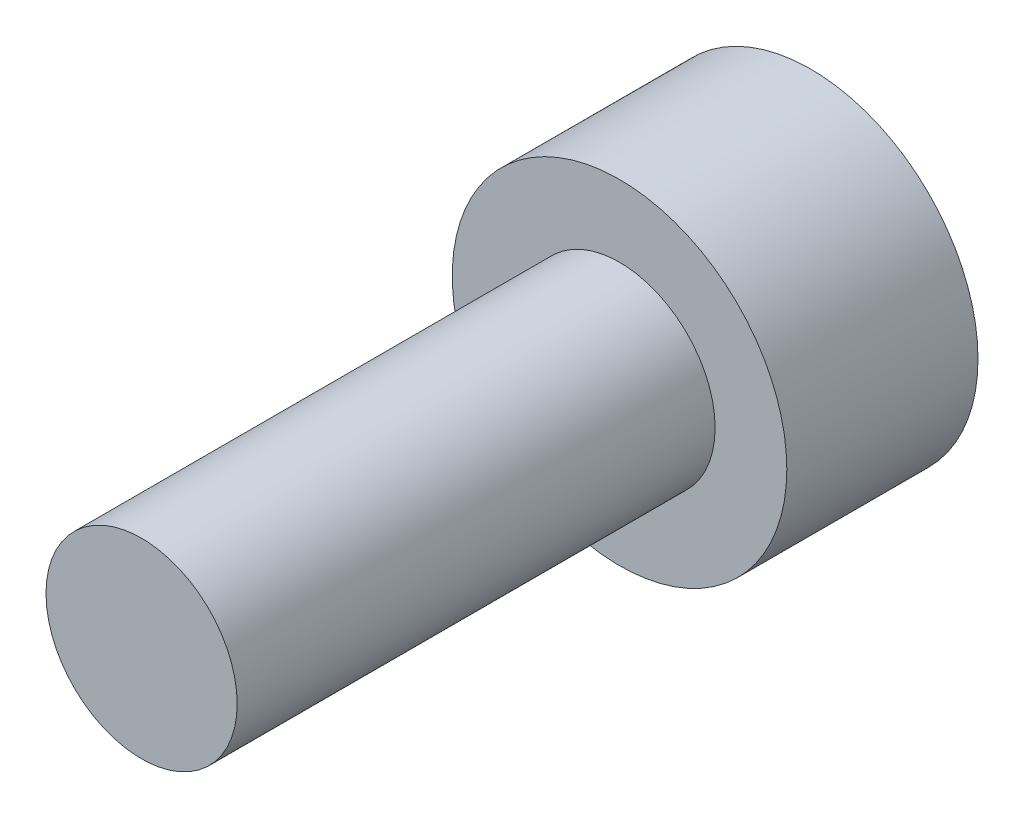
ISO-10303-21;
HEADER;
FILE_DESCRIPTION(('STEP AP214'),'2;1');
FILE_NAME('part.step','',(''),(''),'','','');
FILE_SCHEMA(('AUTOMOTIVE_DESIGN { 1 0 10303 214 1 1 1 1 }'));
ENDSEC;
DATA;
#1=APPLICATION_CONTEXT('core data for automotive mechanical design processes');
#2=APPLICATION_PROTOCOL_DEFINITION('international standard','automotive_design',2000,#1);
#3=PRODUCT_CONTEXT('',#1,'mechanical');
#4=PRODUCT('Part','Part','',(#3));
#5=PRODUCT_RELATED_PRODUCT_CATEGORY('part','',(#4));
#6=PRODUCT_DEFINITION_FORMATION('','',#4);
#7=PRODUCT_DEFINITION_CONTEXT('part definition',#1,'design');
#8=PRODUCT_DEFINITION('design','',#6,#7);
#9=PRODUCT_DEFINITION_SHAPE('','',#8);
#10=(LENGTH_UNIT() NAMED_UNIT(*) SI_UNIT(.MILLI.,.METRE.));
#11=(NAMED_UNIT(*) PLANE_ANGLE_UNIT() SI_UNIT($,.RADIAN.));
#12=(NAMED_UNIT(*) SI_UNIT($,.STERADIAN.) SOLID_ANGLE_UNIT());
#13=UNCERTAINTY_MEASURE_WITH_UNIT(LENGTH_MEASURE(1.E-05),#10,'distance_accuracy_value','');
#14=(GEOMETRIC_REPRESENTATION_CONTEXT(3) GLOBAL_UNCERTAINTY_ASSIGNED_CONTEXT((#13)) GLOBAL_UNIT_ASSIGNED_CONTEXT((#10,
#11,#12)) REPRESENTATION_CONTEXT('',''));
#15=CARTESIAN_POINT('',(0.,0.,0.));
#16=DIRECTION('',(0.,0.,1.));
#17=DIRECTION('',(1.,0.,0.));
#18=AXIS2_PLACEMENT_3D('',#15,#16,#17);
#19=CARTESIAN_POINT('',(0.,0.,4.));
#20=DIRECTION('',(0.,0.,-1.));
#21=DIRECTION('',(-1.,0.,0.));
#22=AXIS2_PLACEMENT_3D('',#19,#20,#21);
#23=CYLINDRICAL_SURFACE('',#22,3.5);
#24=CARTESIAN_POINT('',(0.,0.,4.));
#25=DIRECTION('',(0.,0.,1.));
#26=DIRECTION('',(1.,0.,0.));
#27=AXIS2_PLACEMENT_3D('',#24,#25,#26);
#28=CIRCLE('',#27,3.5);
#29=CARTESIAN_POINT('',(3.5,0.,4.));
#30=VERTEX_POINT('',#29);
#31=EDGE_CURVE('E46',#30,#30,#28,.T.);
#32=ORIENTED_EDGE('',*,*,#31,.F.);
#33=EDGE_LOOP('',(#32));
#34=FACE_BOUND('',#33,.T.);
#35=CARTESIAN_POINT('',(0.,0.,0.));
#36=DIRECTION('',(0.,0.,1.));
#37=DIRECTION('',(1.,0.,0.));
#38=AXIS2_PLACEMENT_3D('',#35,#36,#37);
#39=CIRCLE('',#38,3.5);
#40=CARTESIAN_POINT('',(3.5,0.,0.));
#41=VERTEX_POINT('',#40);
#42=EDGE_CURVE('E42',#41,#41,#39,.T.);
#43=ORIENTED_EDGE('',*,*,#42,.T.);
#44=EDGE_LOOP('',(#43));
#45=FACE_BOUND('',#44,.T.);
#46=ADVANCED_FACE('F39',(#34,#45),#23,.T.);
#47=CARTESIAN_POINT('',(0.,0.,4.));
#48=DIRECTION('',(0.,0.,1.));
#49=DIRECTION('',(1.,0.,0.));
#50=AXIS2_PLACEMENT_3D('',#47,#48,#49);
#51=PLANE('',#50);
#52=CARTESIAN_POINT('',(0.,0.,4.));
#53=DIRECTION('',(0.,0.,1.));
#54=DIRECTION('',(1.,0.,0.));
#55=AXIS2_PLACEMENT_3D('',#52,#53,#54);
#56=CIRCLE('',#55,2.);
#57=CARTESIAN_POINT('',(2.,0.,4.));
#58=VERTEX_POINT('',#57);
#59=EDGE_CURVE('E10',#58,#58,#56,.T.);
#60=ORIENTED_EDGE('',*,*,#59,.F.);
#61=EDGE_LOOP('',(#60));
#62=FACE_BOUND('',#61,.T.);
#63=ORIENTED_EDGE('',*,*,#31,.T.);
#64=EDGE_LOOP('',(#63));
#65=FACE_BOUND('',#64,.T.);
#66=ADVANCED_FACE('F63',(#62,#65),#51,.T.);
#67=CARTESIAN_POINT('',(0.,0.,0.));
#68=DIRECTION('',(0.,0.,1.));
#69=DIRECTION('',(1.,0.,0.));
#70=AXIS2_PLACEMENT_3D('',#67,#68,#69);
#71=PLANE('',#70);
#72=ORIENTED_EDGE('',*,*,#42,.F.);
#73=EDGE_LOOP('',(#72));
#74=FACE_BOUND('',#73,.T.);
#75=ADVANCED_FACE('F60',(#74),#71,.F.);
#76=CARTESIAN_POINT('',(0.,0.,14.));
#77=DIRECTION('',(0.,0.,-1.));
#78=DIRECTION('',(-1.,0.,0.));
#79=AXIS2_PLACEMENT_3D('',#76,#77,#78);
#80=CYLINDRICAL_SURFACE('',#79,2.);
#81=CARTESIAN_POINT('',(0.,0.,14.));
#82=DIRECTION('',(0.,0.,1.));
#83=DIRECTION('',(1.,0.,0.));
#84=AXIS2_PLACEMENT_3D('',#81,#82,#83);
#85=CIRCLE('',#84,2.);
#86=CARTESIAN_POINT('',(2.,0.,14.));
#87=VERTEX_POINT('',#86);
#88=EDGE_CURVE('E52',#87,#87,#85,.T.);
#89=ORIENTED_EDGE('',*,*,#88,.F.);
#90=EDGE_LOOP('',(#89));
#91=FACE_BOUND('',#90,.T.);
#92=ORIENTED_EDGE('',*,*,#59,.T.);
#93=EDGE_LOOP('',(#92));
#94=FACE_BOUND('',#93,.T.);
#95=ADVANCED_FACE('F62',(#91,#94),#80,.T.);
#96=CARTESIAN_POINT('',(0.,0.,14.));
#97=DIRECTION('',(0.,0.,1.));
#98=DIRECTION('',(1.,0.,0.));
#99=AXIS2_PLACEMENT_3D('',#96,#97,#98);
#100=PLANE('',#99);
#101=ORIENTED_EDGE('',*,*,#88,.T.);
#102=EDGE_LOOP('',(#101));
#103=FACE_BOUND('',#102,.T.);
#104=ADVANCED_FACE('F69',(#103),#100,.T.);
#105=CLOSED_SHELL('',(#46,#66,#75,#95,#104));
#106=MANIFOLD_SOLID_BREP('B2',#105);
#107=ADVANCED_BREP_SHAPE_REPRESENTATION('',(#18,#106),#14);
#108=SHAPE_DEFINITION_REPRESENTATION(#9,#107);
ENDSEC;
END-ISO-10303-21;
